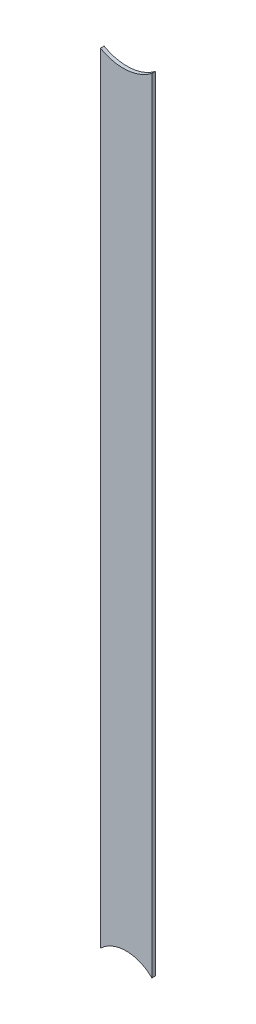
ISO-10303-21;
HEADER;
FILE_DESCRIPTION(('STEP AP214'),'2;1');
FILE_NAME('part.step','',(''),(''),'','','');
FILE_SCHEMA(('AUTOMOTIVE_DESIGN { 1 0 10303 214 1 1 1 1 }'));
ENDSEC;
DATA;
#1=APPLICATION_CONTEXT('core data for automotive mechanical design processes');
#2=APPLICATION_PROTOCOL_DEFINITION('international standard','automotive_design',2000,#1);
#3=PRODUCT_CONTEXT('',#1,'mechanical');
#4=PRODUCT('Part','Part','',(#3));
#5=PRODUCT_RELATED_PRODUCT_CATEGORY('part','',(#4));
#6=PRODUCT_DEFINITION_FORMATION('','',#4);
#7=PRODUCT_DEFINITION_CONTEXT('part definition',#1,'design');
#8=PRODUCT_DEFINITION('design','',#6,#7);
#9=PRODUCT_DEFINITION_SHAPE('','',#8);
#10=(LENGTH_UNIT() NAMED_UNIT(*) SI_UNIT(.MILLI.,.METRE.));
#11=(NAMED_UNIT(*) PLANE_ANGLE_UNIT() SI_UNIT($,.RADIAN.));
#12=(NAMED_UNIT(*) SI_UNIT($,.STERADIAN.) SOLID_ANGLE_UNIT());
#13=UNCERTAINTY_MEASURE_WITH_UNIT(LENGTH_MEASURE(1.E-05),#10,'distance_accuracy_value','');
#14=(GEOMETRIC_REPRESENTATION_CONTEXT(3) GLOBAL_UNCERTAINTY_ASSIGNED_CONTEXT((#13)) GLOBAL_UNIT_ASSIGNED_CONTEXT((#10,
#11,#12)) REPRESENTATION_CONTEXT('',''));
#15=CARTESIAN_POINT('',(0.,0.,0.));
#16=DIRECTION('',(0.,0.,1.));
#17=DIRECTION('',(1.,0.,0.));
#18=AXIS2_PLACEMENT_3D('',#15,#16,#17);
#19=CARTESIAN_POINT('',(50.92887706,86.2039160755931,0.));
#20=DIRECTION('',(-1.,0.,0.));
#21=DIRECTION('',(0.,1.,0.));
#22=AXIS2_PLACEMENT_3D('',#19,#20,#21);
#23=PLANE('',#22);
#24=DIRECTION('',(0.,1.,0.));
#25=VECTOR('',#24,1.);
#26=CARTESIAN_POINT('',(50.92887706,85.95102952,0.03556));
#27=LINE('',#26,#25);
#28=CARTESIAN_POINT('',(50.92887706,86.2039160755931,0.03556));
#29=VERTEX_POINT('',#28);
#30=CARTESIAN_POINT('',(50.92887706,93.8140538390169,0.03556));
#31=VERTEX_POINT('',#30);
#32=EDGE_CURVE('E11',#29,#31,#27,.T.);
#33=ORIENTED_EDGE('',*,*,#32,.F.);
#34=DIRECTION('',(0.,0.,1.));
#35=VECTOR('',#34,1.);
#36=CARTESIAN_POINT('',(50.92887706,86.2039160755931,0.));
#37=LINE('',#36,#35);
#38=CARTESIAN_POINT('',(50.92887706,86.2039160755931,0.));
#39=VERTEX_POINT('',#38);
#40=EDGE_CURVE('E24',#39,#29,#37,.T.);
#41=ORIENTED_EDGE('',*,*,#40,.F.);
#42=DIRECTION('',(0.,1.,0.));
#43=VECTOR('',#42,1.);
#44=CARTESIAN_POINT('',(50.92887706,85.95102952,0.));
#45=LINE('',#44,#43);
#46=CARTESIAN_POINT('',(50.92887706,93.8140538390169,0.));
#47=VERTEX_POINT('',#46);
#48=EDGE_CURVE('E75',#39,#47,#45,.T.);
#49=ORIENTED_EDGE('',*,*,#48,.T.);
#50=DIRECTION('',(0.,0.,1.));
#51=VECTOR('',#50,1.);
#52=CARTESIAN_POINT('',(50.92887706,93.8140538390169,0.));
#53=LINE('',#52,#51);
#54=EDGE_CURVE('E37',#47,#31,#53,.T.);
#55=ORIENTED_EDGE('',*,*,#54,.T.);
#56=EDGE_LOOP('',(#33,#41,#49,#55));
#57=FACE_BOUND('',#56,.T.);
#58=ADVANCED_FACE('F17',(#57),#23,.F.);
#59=CARTESIAN_POINT('',(50.6510036,94.1680108,0.));
#60=DIRECTION('',(0.,0.,-1.));
#61=DIRECTION('',(1.,0.,0.));
#62=AXIS2_PLACEMENT_3D('',#59,#60,#61);
#63=CYLINDRICAL_SURFACE('',#62,0.4499991);
#64=DIRECTION('',(0.,0.,1.));
#65=VECTOR('',#64,1.);
#66=CARTESIAN_POINT('',(50.42887806,93.7766549076456,0.));
#67=LINE('',#66,#65);
#68=CARTESIAN_POINT('',(50.42887806,93.7766549076456,0.));
#69=VERTEX_POINT('',#68);
#70=CARTESIAN_POINT('',(50.42887806,93.7766549076456,0.03556));
#71=VERTEX_POINT('',#70);
#72=EDGE_CURVE('E67',#69,#71,#67,.T.);
#73=ORIENTED_EDGE('',*,*,#72,.T.);
#74=CARTESIAN_POINT('',(50.6510036,94.1680108,0.03556));
#75=DIRECTION('',(0.,0.,1.));
#76=DIRECTION('',(1.,0.,0.));
#77=AXIS2_PLACEMENT_3D('',#74,#75,#76);
#78=CIRCLE('',#77,0.4499991);
#79=EDGE_CURVE('E82',#71,#31,#78,.T.);
#80=ORIENTED_EDGE('',*,*,#79,.T.);
#81=ORIENTED_EDGE('',*,*,#54,.F.);
#82=CARTESIAN_POINT('',(50.6510036,94.1680108,0.));
#83=DIRECTION('',(0.,0.,1.));
#84=DIRECTION('',(1.,0.,0.));
#85=AXIS2_PLACEMENT_3D('',#82,#83,#84);
#86=CIRCLE('',#85,0.4499991);
#87=EDGE_CURVE('E80',#69,#47,#86,.T.);
#88=ORIENTED_EDGE('',*,*,#87,.F.);
#89=EDGE_LOOP('',(#73,#80,#81,#88));
#90=FACE_BOUND('',#89,.T.);
#91=ADVANCED_FACE('F88',(#90),#63,.F.);
#92=CARTESIAN_POINT('',(50.42887806,93.7766549076456,0.));
#93=DIRECTION('',(1.,0.,0.));
#94=DIRECTION('',(0.,-1.,0.));
#95=AXIS2_PLACEMENT_3D('',#92,#93,#94);
#96=PLANE('',#95);
#97=DIRECTION('',(0.,-1.,0.));
#98=VECTOR('',#97,1.);
#99=CARTESIAN_POINT('',(50.42887806,94.14013684,0.03556));
#100=LINE('',#99,#98);
#101=CARTESIAN_POINT('',(50.42887806,86.2039160755931,0.03556));
#102=VERTEX_POINT('',#101);
#103=EDGE_CURVE('E71',#71,#102,#100,.T.);
#104=ORIENTED_EDGE('',*,*,#103,.F.);
#105=ORIENTED_EDGE('',*,*,#72,.F.);
#106=DIRECTION('',(0.,-1.,0.));
#107=VECTOR('',#106,1.);
#108=CARTESIAN_POINT('',(50.42887806,94.14013684,0.));
#109=LINE('',#108,#107);
#110=CARTESIAN_POINT('',(50.42887806,86.2039160755931,0.));
#111=VERTEX_POINT('',#110);
#112=EDGE_CURVE('E63',#69,#111,#109,.T.);
#113=ORIENTED_EDGE('',*,*,#112,.T.);
#114=DIRECTION('',(0.,0.,1.));
#115=VECTOR('',#114,1.);
#116=CARTESIAN_POINT('',(50.42887806,86.2039160755931,0.));
#117=LINE('',#116,#115);
#118=EDGE_CURVE('E53',#111,#102,#117,.T.);
#119=ORIENTED_EDGE('',*,*,#118,.T.);
#120=EDGE_LOOP('',(#104,#105,#113,#119));
#121=FACE_BOUND('',#120,.T.);
#122=ADVANCED_FACE('F66',(#121),#96,.F.);
#123=CARTESIAN_POINT('',(50.67887756,85.95102952,0.));
#124=DIRECTION('',(0.,0.,-1.));
#125=DIRECTION('',(1.,0.,0.));
#126=AXIS2_PLACEMENT_3D('',#123,#124,#125);
#127=CYLINDRICAL_SURFACE('',#126,0.3556);
#128=ORIENTED_EDGE('',*,*,#40,.T.);
#129=CARTESIAN_POINT('',(50.67887756,85.95102952,0.03556));
#130=DIRECTION('',(0.,0.,1.));
#131=DIRECTION('',(1.,0.,0.));
#132=AXIS2_PLACEMENT_3D('',#129,#130,#131);
#133=CIRCLE('',#132,0.3556);
#134=EDGE_CURVE('E59',#29,#102,#133,.T.);
#135=ORIENTED_EDGE('',*,*,#134,.T.);
#136=ORIENTED_EDGE('',*,*,#118,.F.);
#137=CARTESIAN_POINT('',(50.67887756,85.95102952,0.));
#138=DIRECTION('',(0.,0.,1.));
#139=DIRECTION('',(1.,0.,0.));
#140=AXIS2_PLACEMENT_3D('',#137,#138,#139);
#141=CIRCLE('',#140,0.3556);
#142=EDGE_CURVE('E57',#39,#111,#141,.T.);
#143=ORIENTED_EDGE('',*,*,#142,.F.);
#144=EDGE_LOOP('',(#128,#135,#136,#143));
#145=FACE_BOUND('',#144,.T.);
#146=ADVANCED_FACE('F55',(#145),#127,.F.);
#147=CARTESIAN_POINT('',(50.92887706,85.95102952,0.));
#148=DIRECTION('',(0.,0.,-1.));
#149=DIRECTION('',(-1.,0.,0.));
#150=AXIS2_PLACEMENT_3D('',#147,#148,#149);
#151=PLANE('',#150);
#152=ORIENTED_EDGE('',*,*,#48,.F.);
#153=ORIENTED_EDGE('',*,*,#142,.T.);
#154=ORIENTED_EDGE('',*,*,#112,.F.);
#155=ORIENTED_EDGE('',*,*,#87,.T.);
#156=EDGE_LOOP('',(#152,#153,#154,#155));
#157=FACE_BOUND('',#156,.T.);
#158=ADVANCED_FACE('F74',(#157),#151,.T.);
#159=CARTESIAN_POINT('',(50.92887706,85.95102952,0.03556));
#160=DIRECTION('',(0.,0.,-1.));
#161=DIRECTION('',(-1.,0.,0.));
#162=AXIS2_PLACEMENT_3D('',#159,#160,#161);
#163=PLANE('',#162);
#164=ORIENTED_EDGE('',*,*,#134,.F.);
#165=ORIENTED_EDGE('',*,*,#32,.T.);
#166=ORIENTED_EDGE('',*,*,#79,.F.);
#167=ORIENTED_EDGE('',*,*,#103,.T.);
#168=EDGE_LOOP('',(#164,#165,#166,#167));
#169=FACE_BOUND('',#168,.T.);
#170=ADVANCED_FACE('F91',(#169),#163,.F.);
#171=CLOSED_SHELL('',(#58,#91,#122,#146,#158,#170));
#172=MANIFOLD_SOLID_BREP('B1',#171);
#173=ADVANCED_BREP_SHAPE_REPRESENTATION('',(#18,#172),#14);
#174=SHAPE_DEFINITION_REPRESENTATION(#9,#173);
ENDSEC;
END-ISO-10303-21;
